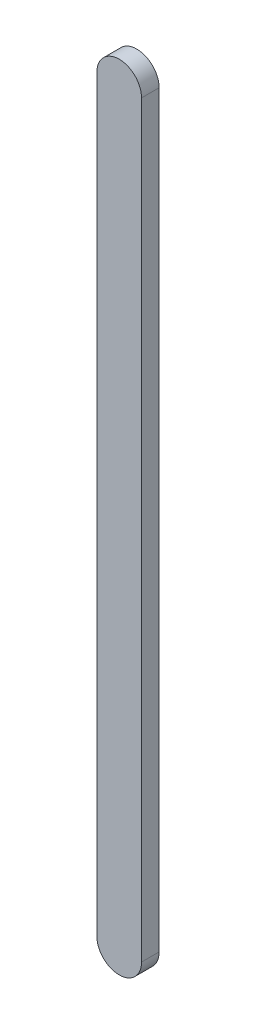
ISO-10303-21;
HEADER;
FILE_DESCRIPTION(('STEP AP214'),'2;1');
FILE_NAME('part.step','',(''),(''),'','','');
FILE_SCHEMA(('AUTOMOTIVE_DESIGN { 1 0 10303 214 1 1 1 1 }'));
ENDSEC;
DATA;
#1=APPLICATION_CONTEXT('core data for automotive mechanical design processes');
#2=APPLICATION_PROTOCOL_DEFINITION('international standard','automotive_design',2000,#1);
#3=PRODUCT_CONTEXT('',#1,'mechanical');
#4=PRODUCT('Part','Part','',(#3));
#5=PRODUCT_RELATED_PRODUCT_CATEGORY('part','',(#4));
#6=PRODUCT_DEFINITION_FORMATION('','',#4);
#7=PRODUCT_DEFINITION_CONTEXT('part definition',#1,'design');
#8=PRODUCT_DEFINITION('design','',#6,#7);
#9=PRODUCT_DEFINITION_SHAPE('','',#8);
#10=(LENGTH_UNIT() NAMED_UNIT(*) SI_UNIT(.MILLI.,.METRE.));
#11=(NAMED_UNIT(*) PLANE_ANGLE_UNIT() SI_UNIT($,.RADIAN.));
#12=(NAMED_UNIT(*) SI_UNIT($,.STERADIAN.) SOLID_ANGLE_UNIT());
#13=UNCERTAINTY_MEASURE_WITH_UNIT(LENGTH_MEASURE(1.E-05),#10,'distance_accuracy_value','');
#14=(GEOMETRIC_REPRESENTATION_CONTEXT(3) GLOBAL_UNCERTAINTY_ASSIGNED_CONTEXT((#13)) GLOBAL_UNIT_ASSIGNED_CONTEXT((#10,
#11,#12)) REPRESENTATION_CONTEXT('',''));
#15=CARTESIAN_POINT('',(0.,0.,0.));
#16=DIRECTION('',(0.,0.,1.));
#17=DIRECTION('',(1.,0.,0.));
#18=AXIS2_PLACEMENT_3D('',#15,#16,#17);
#19=CARTESIAN_POINT('',(97.028,66.802,0.));
#20=DIRECTION('',(-1.,0.,0.));
#21=DIRECTION('',(0.,1.,0.));
#22=AXIS2_PLACEMENT_3D('',#19,#20,#21);
#23=PLANE('',#22);
#24=DIRECTION('',(0.,1.,0.));
#25=VECTOR('',#24,1.);
#26=CARTESIAN_POINT('',(97.028,66.802,0.1999996));
#27=LINE('',#26,#25);
#28=CARTESIAN_POINT('',(97.028,66.802,0.1999996));
#29=VERTEX_POINT('',#28);
#30=CARTESIAN_POINT('',(97.028,75.3080028,0.1999996));
#31=VERTEX_POINT('',#30);
#32=EDGE_CURVE('E11',#29,#31,#27,.T.);
#33=ORIENTED_EDGE('',*,*,#32,.F.);
#34=DIRECTION('',(0.,0.,1.));
#35=VECTOR('',#34,1.);
#36=CARTESIAN_POINT('',(97.028,66.802,0.));
#37=LINE('',#36,#35);
#38=CARTESIAN_POINT('',(97.028,66.802,0.));
#39=VERTEX_POINT('',#38);
#40=EDGE_CURVE('E24',#39,#29,#37,.T.);
#41=ORIENTED_EDGE('',*,*,#40,.F.);
#42=DIRECTION('',(0.,1.,0.));
#43=VECTOR('',#42,1.);
#44=CARTESIAN_POINT('',(97.028,66.802,0.));
#45=LINE('',#44,#43);
#46=CARTESIAN_POINT('',(97.028,75.3080028,0.));
#47=VERTEX_POINT('',#46);
#48=EDGE_CURVE('E75',#39,#47,#45,.T.);
#49=ORIENTED_EDGE('',*,*,#48,.T.);
#50=DIRECTION('',(0.,0.,1.));
#51=VECTOR('',#50,1.);
#52=CARTESIAN_POINT('',(97.028,75.3080028,0.));
#53=LINE('',#52,#51);
#54=EDGE_CURVE('E37',#47,#31,#53,.T.);
#55=ORIENTED_EDGE('',*,*,#54,.T.);
#56=EDGE_LOOP('',(#33,#41,#49,#55));
#57=FACE_BOUND('',#56,.T.);
#58=ADVANCED_FACE('F17',(#57),#23,.F.);
#59=CARTESIAN_POINT('',(96.774,75.3080028,0.));
#60=DIRECTION('',(0.,0.,-1.));
#61=DIRECTION('',(1.,1.11896493820486E-13,0.));
#62=AXIS2_PLACEMENT_3D('',#59,#60,#61);
#63=CYLINDRICAL_SURFACE('',#62,0.25400000000001);
#64=CARTESIAN_POINT('',(96.774,75.3080028,0.1999996));
#65=DIRECTION('',(0.,0.,1.));
#66=DIRECTION('',(1.,1.11896493820486E-13,0.));
#67=AXIS2_PLACEMENT_3D('',#64,#65,#66);
#68=CIRCLE('',#67,0.25400000000001);
#69=CARTESIAN_POINT('',(96.52,75.3080028,0.1999996));
#70=VERTEX_POINT('',#69);
#71=EDGE_CURVE('E83',#31,#70,#68,.T.);
#72=ORIENTED_EDGE('',*,*,#71,.F.);
#73=ORIENTED_EDGE('',*,*,#54,.F.);
#74=CARTESIAN_POINT('',(96.774,75.3080028,0.));
#75=DIRECTION('',(0.,0.,1.));
#76=DIRECTION('',(1.,1.11896493820486E-13,0.));
#77=AXIS2_PLACEMENT_3D('',#74,#75,#76);
#78=CIRCLE('',#77,0.25400000000001);
#79=CARTESIAN_POINT('',(96.52,75.3080028,0.));
#80=VERTEX_POINT('',#79);
#81=EDGE_CURVE('E81',#47,#80,#78,.T.);
#82=ORIENTED_EDGE('',*,*,#81,.T.);
#83=DIRECTION('',(0.,0.,1.));
#84=VECTOR('',#83,1.);
#85=CARTESIAN_POINT('',(96.52,75.3080028,0.));
#86=LINE('',#85,#84);
#87=EDGE_CURVE('E67',#80,#70,#86,.T.);
#88=ORIENTED_EDGE('',*,*,#87,.T.);
#89=EDGE_LOOP('',(#72,#73,#82,#88));
#90=FACE_BOUND('',#89,.T.);
#91=ADVANCED_FACE('F89',(#90),#63,.T.);
#92=CARTESIAN_POINT('',(96.52,75.3080028,0.));
#93=DIRECTION('',(1.,0.,0.));
#94=DIRECTION('',(0.,-1.,0.));
#95=AXIS2_PLACEMENT_3D('',#92,#93,#94);
#96=PLANE('',#95);
#97=DIRECTION('',(0.,-1.,0.));
#98=VECTOR('',#97,1.);
#99=CARTESIAN_POINT('',(96.52,75.3080028,0.1999996));
#100=LINE('',#99,#98);
#101=CARTESIAN_POINT('',(96.52,66.802,0.1999996));
#102=VERTEX_POINT('',#101);
#103=EDGE_CURVE('E71',#70,#102,#100,.T.);
#104=ORIENTED_EDGE('',*,*,#103,.F.);
#105=ORIENTED_EDGE('',*,*,#87,.F.);
#106=DIRECTION('',(0.,-1.,0.));
#107=VECTOR('',#106,1.);
#108=CARTESIAN_POINT('',(96.52,75.3080028,0.));
#109=LINE('',#108,#107);
#110=CARTESIAN_POINT('',(96.52,66.802,0.));
#111=VERTEX_POINT('',#110);
#112=EDGE_CURVE('E63',#80,#111,#109,.T.);
#113=ORIENTED_EDGE('',*,*,#112,.T.);
#114=DIRECTION('',(0.,0.,1.));
#115=VECTOR('',#114,1.);
#116=CARTESIAN_POINT('',(96.52,66.802,0.));
#117=LINE('',#116,#115);
#118=EDGE_CURVE('E53',#111,#102,#117,.T.);
#119=ORIENTED_EDGE('',*,*,#118,.T.);
#120=EDGE_LOOP('',(#104,#105,#113,#119));
#121=FACE_BOUND('',#120,.T.);
#122=ADVANCED_FACE('F66',(#121),#96,.F.);
#123=CARTESIAN_POINT('',(96.774,66.802,0.));
#124=DIRECTION('',(0.,0.,-1.));
#125=DIRECTION('',(-1.,0.,0.));
#126=AXIS2_PLACEMENT_3D('',#123,#124,#125);
#127=CYLINDRICAL_SURFACE('',#126,0.25400000000001);
#128=CARTESIAN_POINT('',(96.774,66.802,0.1999996));
#129=DIRECTION('',(0.,0.,1.));
#130=DIRECTION('',(-1.,0.,0.));
#131=AXIS2_PLACEMENT_3D('',#128,#129,#130);
#132=CIRCLE('',#131,0.25400000000001);
#133=EDGE_CURVE('E59',#102,#29,#132,.T.);
#134=ORIENTED_EDGE('',*,*,#133,.F.);
#135=ORIENTED_EDGE('',*,*,#118,.F.);
#136=CARTESIAN_POINT('',(96.774,66.802,0.));
#137=DIRECTION('',(0.,0.,1.));
#138=DIRECTION('',(-1.,0.,0.));
#139=AXIS2_PLACEMENT_3D('',#136,#137,#138);
#140=CIRCLE('',#139,0.25400000000001);
#141=EDGE_CURVE('E57',#111,#39,#140,.T.);
#142=ORIENTED_EDGE('',*,*,#141,.T.);
#143=ORIENTED_EDGE('',*,*,#40,.T.);
#144=EDGE_LOOP('',(#134,#135,#142,#143));
#145=FACE_BOUND('',#144,.T.);
#146=ADVANCED_FACE('F55',(#145),#127,.T.);
#147=CARTESIAN_POINT('',(97.028,66.802,0.));
#148=DIRECTION('',(0.,0.,-1.));
#149=DIRECTION('',(-1.,0.,0.));
#150=AXIS2_PLACEMENT_3D('',#147,#148,#149);
#151=PLANE('',#150);
#152=ORIENTED_EDGE('',*,*,#141,.F.);
#153=ORIENTED_EDGE('',*,*,#112,.F.);
#154=ORIENTED_EDGE('',*,*,#81,.F.);
#155=ORIENTED_EDGE('',*,*,#48,.F.);
#156=EDGE_LOOP('',(#152,#153,#154,#155));
#157=FACE_BOUND('',#156,.T.);
#158=ADVANCED_FACE('F74',(#157),#151,.T.);
#159=CARTESIAN_POINT('',(97.028,66.802,0.1999996));
#160=DIRECTION('',(0.,0.,-1.));
#161=DIRECTION('',(-1.,0.,0.));
#162=AXIS2_PLACEMENT_3D('',#159,#160,#161);
#163=PLANE('',#162);
#164=ORIENTED_EDGE('',*,*,#32,.T.);
#165=ORIENTED_EDGE('',*,*,#71,.T.);
#166=ORIENTED_EDGE('',*,*,#103,.T.);
#167=ORIENTED_EDGE('',*,*,#133,.T.);
#168=EDGE_LOOP('',(#164,#165,#166,#167));
#169=FACE_BOUND('',#168,.T.);
#170=ADVANCED_FACE('F91',(#169),#163,.F.);
#171=CLOSED_SHELL('',(#58,#91,#122,#146,#158,#170));
#172=MANIFOLD_SOLID_BREP('B1',#171);
#173=ADVANCED_BREP_SHAPE_REPRESENTATION('',(#18,#172),#14);
#174=SHAPE_DEFINITION_REPRESENTATION(#9,#173);
ENDSEC;
END-ISO-10303-21;
